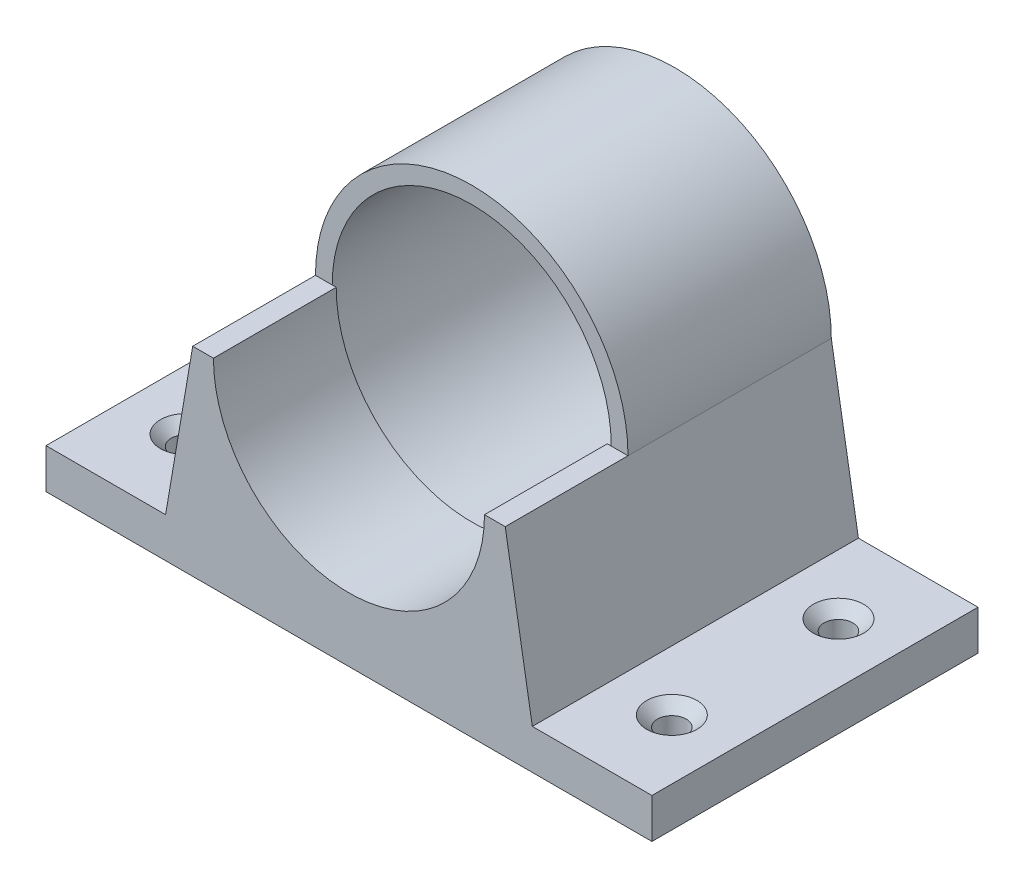
ISO-10303-21;
HEADER;
FILE_DESCRIPTION(('STEP AP214'),'2;1');
FILE_NAME('part.step','',(''),(''),'','','');
FILE_SCHEMA(('AUTOMOTIVE_DESIGN { 1 0 10303 214 1 1 1 1 }'));
ENDSEC;
DATA;
#1=APPLICATION_CONTEXT('core data for automotive mechanical design processes');
#2=APPLICATION_PROTOCOL_DEFINITION('international standard','automotive_design',2000,#1);
#3=PRODUCT_CONTEXT('',#1,'mechanical');
#4=PRODUCT('Part','Part','',(#3));
#5=PRODUCT_RELATED_PRODUCT_CATEGORY('part','',(#4));
#6=PRODUCT_DEFINITION_FORMATION('','',#4);
#7=PRODUCT_DEFINITION_CONTEXT('part definition',#1,'design');
#8=PRODUCT_DEFINITION('design','',#6,#7);
#9=PRODUCT_DEFINITION_SHAPE('','',#8);
#10=(LENGTH_UNIT() NAMED_UNIT(*) SI_UNIT(.MILLI.,.METRE.));
#11=(NAMED_UNIT(*) PLANE_ANGLE_UNIT() SI_UNIT($,.RADIAN.));
#12=(NAMED_UNIT(*) SI_UNIT($,.STERADIAN.) SOLID_ANGLE_UNIT());
#13=UNCERTAINTY_MEASURE_WITH_UNIT(LENGTH_MEASURE(1.E-05),#10,'distance_accuracy_value','');
#14=(GEOMETRIC_REPRESENTATION_CONTEXT(3) GLOBAL_UNCERTAINTY_ASSIGNED_CONTEXT((#13)) GLOBAL_UNIT_ASSIGNED_CONTEXT((#10,
#11,#12)) REPRESENTATION_CONTEXT('',''));
#15=CARTESIAN_POINT('',(0.,0.,0.));
#16=DIRECTION('',(0.,0.,1.));
#17=DIRECTION('',(1.,0.,0.));
#18=AXIS2_PLACEMENT_3D('',#15,#16,#17);
#19=CARTESIAN_POINT('',(0.,18.1533956791324,0.));
#20=DIRECTION('',(0.,0.,-1.));
#21=DIRECTION('',(-1.,0.,0.));
#22=AXIS2_PLACEMENT_3D('',#19,#20,#21);
#23=PLANE('',#22);
#24=CARTESIAN_POINT('',(0.,18.1533956791324,0.));
#25=DIRECTION('',(0.,0.,1.));
#26=DIRECTION('',(1.,0.,0.));
#27=AXIS2_PLACEMENT_3D('',#24,#25,#26);
#28=CIRCLE('',#27,17.5);
#29=CARTESIAN_POINT('',(17.5,18.1533956791324,0.));
#30=VERTEX_POINT('',#29);
#31=CARTESIAN_POINT('',(-17.5,18.1533956791324,0.));
#32=VERTEX_POINT('',#31);
#33=EDGE_CURVE('E226',#30,#32,#28,.T.);
#34=ORIENTED_EDGE('',*,*,#33,.F.);
#35=DIRECTION('',(1.,0.,0.));
#36=VECTOR('',#35,1.);
#37=CARTESIAN_POINT('',(0.,18.1533956791324,0.));
#38=LINE('',#37,#36);
#39=CARTESIAN_POINT('',(19.6,18.1533956791324,0.));
#40=VERTEX_POINT('',#39);
#41=EDGE_CURVE('E258',#30,#40,#38,.T.);
#42=ORIENTED_EDGE('',*,*,#41,.T.);
#43=CARTESIAN_POINT('',(0.,18.1533956791324,0.));
#44=DIRECTION('',(0.,0.,1.));
#45=DIRECTION('',(1.,0.,0.));
#46=AXIS2_PLACEMENT_3D('',#43,#44,#45);
#47=CIRCLE('',#46,19.6);
#48=CARTESIAN_POINT('',(-19.6,18.1533956791324,0.));
#49=VERTEX_POINT('',#48);
#50=EDGE_CURVE('E246',#40,#49,#47,.T.);
#51=ORIENTED_EDGE('',*,*,#50,.T.);
#52=DIRECTION('',(1.,0.,0.));
#53=VECTOR('',#52,1.);
#54=CARTESIAN_POINT('',(0.,18.1533956791324,0.));
#55=LINE('',#54,#53);
#56=EDGE_CURVE('E256',#49,#32,#55,.T.);
#57=ORIENTED_EDGE('',*,*,#56,.T.);
#58=EDGE_LOOP('',(#34,#42,#51,#57));
#59=FACE_BOUND('',#58,.T.);
#60=ADVANCED_FACE('F52',(#59),#23,.F.);
#61=CARTESIAN_POINT('',(0.,18.1533956791324,-25.5));
#62=DIRECTION('',(0.,0.,1.));
#63=DIRECTION('',(1.,0.,0.));
#64=AXIS2_PLACEMENT_3D('',#61,#62,#63);
#65=CYLINDRICAL_SURFACE('',#64,19.6);
#66=DIRECTION('',(0.,0.,-1.));
#67=VECTOR('',#66,1.);
#68=CARTESIAN_POINT('',(-19.6,18.1533956791324,15.4));
#69=LINE('',#68,#67);
#70=CARTESIAN_POINT('',(-19.6,18.1533956791324,-25.5));
#71=VERTEX_POINT('',#70);
#72=EDGE_CURVE('E227',#49,#71,#69,.T.);
#73=ORIENTED_EDGE('',*,*,#72,.F.);
#74=ORIENTED_EDGE('',*,*,#50,.F.);
#75=DIRECTION('',(0.,0.,-1.));
#76=VECTOR('',#75,1.);
#77=CARTESIAN_POINT('',(19.6,18.1533956791324,15.4));
#78=LINE('',#77,#76);
#79=CARTESIAN_POINT('',(19.6,18.1533956791324,-25.5));
#80=VERTEX_POINT('',#79);
#81=EDGE_CURVE('E223',#40,#80,#78,.T.);
#82=ORIENTED_EDGE('',*,*,#81,.T.);
#83=CARTESIAN_POINT('',(0.,18.1533956791324,-25.5));
#84=DIRECTION('',(0.,0.,-1.));
#85=DIRECTION('',(-1.,0.,0.));
#86=AXIS2_PLACEMENT_3D('',#83,#84,#85);
#87=CIRCLE('',#86,19.6);
#88=EDGE_CURVE('E155',#71,#80,#87,.T.);
#89=ORIENTED_EDGE('',*,*,#88,.F.);
#90=EDGE_LOOP('',(#73,#74,#82,#89));
#91=FACE_BOUND('',#90,.T.);
#92=ADVANCED_FACE('F54',(#91),#65,.T.);
#93=CARTESIAN_POINT('',(0.,18.1533956791324,-25.5));
#94=DIRECTION('',(0.,0.,-1.));
#95=DIRECTION('',(-1.,0.,0.));
#96=AXIS2_PLACEMENT_3D('',#93,#94,#95);
#97=PLANE('',#96);
#98=CARTESIAN_POINT('',(0.,18.1533956791324,-25.5));
#99=DIRECTION('',(0.,0.,1.));
#100=DIRECTION('',(1.,0.,0.));
#101=AXIS2_PLACEMENT_3D('',#98,#99,#100);
#102=CIRCLE('',#101,17.5);
#103=CARTESIAN_POINT('',(17.5,18.1533956791324,-25.5));
#104=VERTEX_POINT('',#103);
#105=EDGE_CURVE('E243',#104,#104,#102,.T.);
#106=ORIENTED_EDGE('',*,*,#105,.T.);
#107=EDGE_LOOP('',(#106));
#108=FACE_BOUND('',#107,.T.);
#109=ORIENTED_EDGE('',*,*,#88,.T.);
#110=DIRECTION('',(0.167595493933869,-0.985855846669817,0.));
#111=VECTOR('',#110,1.);
#112=CARTESIAN_POINT('',(19.6,18.1533956791324,-25.5));
#113=LINE('',#112,#111);
#114=CARTESIAN_POINT('',(23.,-1.84660432086758,-25.5));
#115=VERTEX_POINT('',#114);
#116=EDGE_CURVE('E185',#80,#115,#113,.T.);
#117=ORIENTED_EDGE('',*,*,#116,.T.);
#118=DIRECTION('',(1.,0.,0.));
#119=VECTOR('',#118,1.);
#120=CARTESIAN_POINT('',(23.,-1.84660432086758,-25.5));
#121=LINE('',#120,#119);
#122=CARTESIAN_POINT('',(38.,-1.84660432086758,-25.5));
#123=VERTEX_POINT('',#122);
#124=EDGE_CURVE('E188',#115,#123,#121,.T.);
#125=ORIENTED_EDGE('',*,*,#124,.T.);
#126=DIRECTION('',(0.,-1.,0.));
#127=VECTOR('',#126,1.);
#128=CARTESIAN_POINT('',(38.,-1.84660432086758,-25.5));
#129=LINE('',#128,#127);
#130=CARTESIAN_POINT('',(38.,-6.84660432086758,-25.5));
#131=VERTEX_POINT('',#130);
#132=EDGE_CURVE('E191',#123,#131,#129,.T.);
#133=ORIENTED_EDGE('',*,*,#132,.T.);
#134=DIRECTION('',(1.,0.,0.));
#135=VECTOR('',#134,1.);
#136=CARTESIAN_POINT('',(-38.,-6.84660432086758,-25.5));
#137=LINE('',#136,#135);
#138=CARTESIAN_POINT('',(-38.,-6.84660432086758,-25.5));
#139=VERTEX_POINT('',#138);
#140=EDGE_CURVE('E194',#139,#131,#137,.T.);
#141=ORIENTED_EDGE('',*,*,#140,.F.);
#142=DIRECTION('',(0.,-1.,0.));
#143=VECTOR('',#142,1.);
#144=CARTESIAN_POINT('',(-38.,-1.84660432086758,-25.5));
#145=LINE('',#144,#143);
#146=CARTESIAN_POINT('',(-38.,-1.84660432086758,-25.5));
#147=VERTEX_POINT('',#146);
#148=EDGE_CURVE('E197',#147,#139,#145,.T.);
#149=ORIENTED_EDGE('',*,*,#148,.F.);
#150=DIRECTION('',(-1.,0.,0.));
#151=VECTOR('',#150,1.);
#152=CARTESIAN_POINT('',(-23.,-1.84660432086758,-25.5));
#153=LINE('',#152,#151);
#154=CARTESIAN_POINT('',(-23.,-1.84660432086758,-25.5));
#155=VERTEX_POINT('',#154);
#156=EDGE_CURVE('E200',#155,#147,#153,.T.);
#157=ORIENTED_EDGE('',*,*,#156,.F.);
#158=DIRECTION('',(0.167595493933869,0.985855846669817,0.));
#159=VECTOR('',#158,1.);
#160=CARTESIAN_POINT('',(-23.,-1.84660432086758,-25.5));
#161=LINE('',#160,#159);
#162=EDGE_CURVE('E203',#155,#71,#161,.T.);
#163=ORIENTED_EDGE('',*,*,#162,.T.);
#164=EDGE_LOOP('',(#109,#117,#125,#133,#141,#149,#157,#163));
#165=FACE_BOUND('',#164,.T.);
#166=ADVANCED_FACE('F327',(#108,#165),#97,.T.);
#167=CARTESIAN_POINT('',(0.,18.1533956791324,-25.5));
#168=DIRECTION('',(0.,0.,1.));
#169=DIRECTION('',(1.,0.,0.));
#170=AXIS2_PLACEMENT_3D('',#167,#168,#169);
#171=CYLINDRICAL_SURFACE('',#170,17.5);
#172=ORIENTED_EDGE('',*,*,#105,.F.);
#173=EDGE_LOOP('',(#172));
#174=FACE_BOUND('',#173,.T.);
#175=ORIENTED_EDGE('',*,*,#33,.T.);
#176=CARTESIAN_POINT('',(0.,18.1533956791324,0.));
#177=DIRECTION('',(0.,0.,1.));
#178=DIRECTION('',(1.,0.,0.));
#179=AXIS2_PLACEMENT_3D('',#176,#177,#178);
#180=CIRCLE('',#179,17.5);
#181=EDGE_CURVE('E285',#30,#32,#180,.F.);
#182=ORIENTED_EDGE('',*,*,#181,.F.);
#183=EDGE_LOOP('',(#175,#182));
#184=FACE_BOUND('',#183,.T.);
#185=ADVANCED_FACE('F391',(#174,#184),#171,.F.);
#186=CARTESIAN_POINT('',(-23.,-1.84660432086758,15.4));
#187=DIRECTION('',(-0.985855846669818,0.167595493933869,0.));
#188=DIRECTION('',(-0.167595493933869,-0.985855846669818,0.));
#189=AXIS2_PLACEMENT_3D('',#186,#187,#188);
#190=PLANE('',#189);
#191=CARTESIAN_POINT('',(-19.6,18.1533956791324,15.4));
#192=VERTEX_POINT('',#191);
#193=EDGE_CURVE('E224',#192,#49,#69,.T.);
#194=ORIENTED_EDGE('',*,*,#193,.T.);
#195=ORIENTED_EDGE('',*,*,#72,.T.);
#196=ORIENTED_EDGE('',*,*,#162,.F.);
#197=DIRECTION('',(0.,0.,-1.));
#198=VECTOR('',#197,1.);
#199=CARTESIAN_POINT('',(-23.,-1.84660432086758,15.4));
#200=LINE('',#199,#198);
#201=CARTESIAN_POINT('',(-23.,-1.84660432086758,15.4));
#202=VERTEX_POINT('',#201);
#203=EDGE_CURVE('E228',#202,#155,#200,.T.);
#204=ORIENTED_EDGE('',*,*,#203,.F.);
#205=DIRECTION('',(0.167595493933869,0.985855846669817,0.));
#206=VECTOR('',#205,1.);
#207=CARTESIAN_POINT('',(-23.,-1.84660432086758,15.4));
#208=LINE('',#207,#206);
#209=EDGE_CURVE('E221',#202,#192,#208,.T.);
#210=ORIENTED_EDGE('',*,*,#209,.T.);
#211=EDGE_LOOP('',(#194,#195,#196,#204,#210));
#212=FACE_BOUND('',#211,.T.);
#213=ADVANCED_FACE('F314',(#212),#190,.T.);
#214=CARTESIAN_POINT('',(-23.,-1.84660432086758,15.4));
#215=DIRECTION('',(0.,-1.,0.));
#216=DIRECTION('',(1.,0.,0.));
#217=AXIS2_PLACEMENT_3D('',#214,#215,#216);
#218=PLANE('',#217);
#219=CARTESIAN_POINT('',(-30.5,-1.84660432086758,-15.5));
#220=DIRECTION('',(0.,1.,0.));
#221=DIRECTION('',(0.,0.,1.));
#222=AXIS2_PLACEMENT_3D('',#219,#220,#221);
#223=CIRCLE('',#222,3.15);
#224=CARTESIAN_POINT('',(-30.5,-1.84660432086758,-12.35));
#225=VERTEX_POINT('',#224);
#226=EDGE_CURVE('E176',#225,#225,#223,.T.);
#227=ORIENTED_EDGE('',*,*,#226,.F.);
#228=EDGE_LOOP('',(#227));
#229=FACE_BOUND('',#228,.T.);
#230=CARTESIAN_POINT('',(-30.5,-1.84660432086758,5.4));
#231=DIRECTION('',(0.,1.,0.));
#232=DIRECTION('',(0.,0.,1.));
#233=AXIS2_PLACEMENT_3D('',#230,#231,#232);
#234=CIRCLE('',#233,3.15);
#235=CARTESIAN_POINT('',(-30.5,-1.84660432086758,8.55));
#236=VERTEX_POINT('',#235);
#237=EDGE_CURVE('E169',#236,#236,#234,.T.);
#238=ORIENTED_EDGE('',*,*,#237,.F.);
#239=EDGE_LOOP('',(#238));
#240=FACE_BOUND('',#239,.T.);
#241=ORIENTED_EDGE('',*,*,#203,.T.);
#242=ORIENTED_EDGE('',*,*,#156,.T.);
#243=DIRECTION('',(0.,0.,-1.));
#244=VECTOR('',#243,1.);
#245=CARTESIAN_POINT('',(-38.,-1.84660432086758,15.4));
#246=LINE('',#245,#244);
#247=CARTESIAN_POINT('',(-38.,-1.84660432086758,15.4));
#248=VERTEX_POINT('',#247);
#249=EDGE_CURVE('E230',#248,#147,#246,.T.);
#250=ORIENTED_EDGE('',*,*,#249,.F.);
#251=DIRECTION('',(-1.,0.,0.));
#252=VECTOR('',#251,1.);
#253=CARTESIAN_POINT('',(-23.,-1.84660432086758,15.4));
#254=LINE('',#253,#252);
#255=EDGE_CURVE('E219',#202,#248,#254,.T.);
#256=ORIENTED_EDGE('',*,*,#255,.F.);
#257=EDGE_LOOP('',(#241,#242,#250,#256));
#258=FACE_BOUND('',#257,.T.);
#259=ADVANCED_FACE('F310',(#229,#240,#258),#218,.F.);
#260=CARTESIAN_POINT('',(-38.,-1.84660432086758,15.4));
#261=DIRECTION('',(1.,0.,0.));
#262=DIRECTION('',(0.,0.,-1.));
#263=AXIS2_PLACEMENT_3D('',#260,#261,#262);
#264=PLANE('',#263);
#265=ORIENTED_EDGE('',*,*,#249,.T.);
#266=ORIENTED_EDGE('',*,*,#148,.T.);
#267=DIRECTION('',(0.,0.,-1.));
#268=VECTOR('',#267,1.);
#269=CARTESIAN_POINT('',(-38.,-6.84660432086758,15.4));
#270=LINE('',#269,#268);
#271=CARTESIAN_POINT('',(-38.,-6.84660432086758,15.4));
#272=VERTEX_POINT('',#271);
#273=EDGE_CURVE('E232',#272,#139,#270,.T.);
#274=ORIENTED_EDGE('',*,*,#273,.F.);
#275=DIRECTION('',(0.,-1.,0.));
#276=VECTOR('',#275,1.);
#277=CARTESIAN_POINT('',(-38.,-1.84660432086758,15.4));
#278=LINE('',#277,#276);
#279=EDGE_CURVE('E217',#248,#272,#278,.T.);
#280=ORIENTED_EDGE('',*,*,#279,.F.);
#281=EDGE_LOOP('',(#265,#266,#274,#280));
#282=FACE_BOUND('',#281,.T.);
#283=ADVANCED_FACE('F313',(#282),#264,.F.);
#284=CARTESIAN_POINT('',(-38.,-6.84660432086758,15.4));
#285=DIRECTION('',(0.,1.,0.));
#286=DIRECTION('',(0.,0.,1.));
#287=AXIS2_PLACEMENT_3D('',#284,#285,#286);
#288=PLANE('',#287);
#289=CARTESIAN_POINT('',(30.5,-6.84660432086761,5.4));
#290=DIRECTION('',(0.,1.,0.));
#291=DIRECTION('',(0.,0.,1.));
#292=AXIS2_PLACEMENT_3D('',#289,#290,#291);
#293=CIRCLE('',#292,1.8);
#294=CARTESIAN_POINT('',(30.5,-6.84660432086761,7.2));
#295=VERTEX_POINT('',#294);
#296=EDGE_CURVE('E294',#295,#295,#293,.T.);
#297=ORIENTED_EDGE('',*,*,#296,.T.);
#298=EDGE_LOOP('',(#297));
#299=FACE_BOUND('',#298,.T.);
#300=CARTESIAN_POINT('',(30.5,-6.84660432086761,-15.5));
#301=DIRECTION('',(0.,1.,0.));
#302=DIRECTION('',(0.,0.,1.));
#303=AXIS2_PLACEMENT_3D('',#300,#301,#302);
#304=CIRCLE('',#303,1.8);
#305=CARTESIAN_POINT('',(30.5,-6.84660432086761,-13.7));
#306=VERTEX_POINT('',#305);
#307=EDGE_CURVE('E303',#306,#306,#304,.T.);
#308=ORIENTED_EDGE('',*,*,#307,.T.);
#309=EDGE_LOOP('',(#308));
#310=FACE_BOUND('',#309,.T.);
#311=CARTESIAN_POINT('',(-30.5,-6.8466043208676,-15.5));
#312=DIRECTION('',(0.,1.,0.));
#313=DIRECTION('',(0.,0.,1.));
#314=AXIS2_PLACEMENT_3D('',#311,#312,#313);
#315=CIRCLE('',#314,1.8);
#316=CARTESIAN_POINT('',(-31.6901796266715,-6.84660432166725,-14.1496398790485));
#317=VERTEX_POINT('',#316);
#318=CARTESIAN_POINT('',(-31.7573024059841,-6.8466043208676,-16.7880957495103));
#319=VERTEX_POINT('',#318);
#320=EDGE_CURVE('E164',#317,#319,#315,.T.);
#321=ORIENTED_EDGE('',*,*,#320,.T.);
#322=CARTESIAN_POINT('',(-32.9482803004892,-6.84660432086758,-15.4377153410314));
#323=DIRECTION('',(0.,1.,0.));
#324=DIRECTION('',(0.999676555950965,0.,-0.0254319382276887));
#325=AXIS2_PLACEMENT_3D('',#322,#323,#324);
#326=ELLIPSE('',#325,1.80117420355769,1.79999999999999);
#327=EDGE_CURVE('E159',#319,#317,#326,.T.);
#328=ORIENTED_EDGE('',*,*,#327,.T.);
#329=EDGE_LOOP('',(#321,#328));
#330=FACE_BOUND('',#329,.T.);
#331=CARTESIAN_POINT('',(-30.5,-6.8466043208676,5.4));
#332=DIRECTION('',(0.,1.,0.));
#333=DIRECTION('',(0.,0.,1.));
#334=AXIS2_PLACEMENT_3D('',#331,#332,#333);
#335=CIRCLE('',#334,1.8);
#336=CARTESIAN_POINT('',(-31.1501324707505,-6.84660432166725,7.07848972903497));
#337=VERTEX_POINT('',#336);
#338=CARTESIAN_POINT('',(-31.2346383830945,-6.8466043208676,3.75673908155633));
#339=VERTEX_POINT('',#338);
#340=EDGE_CURVE('E182',#337,#339,#335,.T.);
#341=ORIENTED_EDGE('',*,*,#340,.T.);
#342=CARTESIAN_POINT('',(-31.885222499378,-6.84660432086758,5.43524029129845));
#343=DIRECTION('',(0.,1.,0.));
#344=DIRECTION('',(0.999676555950965,0.,-0.0254319382276887));
#345=AXIS2_PLACEMENT_3D('',#342,#343,#344);
#346=ELLIPSE('',#345,1.80117420355771,1.8);
#347=EDGE_CURVE('E165',#339,#337,#346,.T.);
#348=ORIENTED_EDGE('',*,*,#347,.T.);
#349=EDGE_LOOP('',(#341,#348));
#350=FACE_BOUND('',#349,.T.);
#351=ORIENTED_EDGE('',*,*,#273,.T.);
#352=ORIENTED_EDGE('',*,*,#140,.T.);
#353=DIRECTION('',(0.,0.,-1.));
#354=VECTOR('',#353,1.);
#355=CARTESIAN_POINT('',(38.,-6.84660432086758,15.4));
#356=LINE('',#355,#354);
#357=CARTESIAN_POINT('',(38.,-6.84660432086758,15.4));
#358=VERTEX_POINT('',#357);
#359=EDGE_CURVE('E234',#358,#131,#356,.T.);
#360=ORIENTED_EDGE('',*,*,#359,.F.);
#361=DIRECTION('',(1.,0.,0.));
#362=VECTOR('',#361,1.);
#363=CARTESIAN_POINT('',(-38.,-6.84660432086758,15.4));
#364=LINE('',#363,#362);
#365=EDGE_CURVE('E215',#272,#358,#364,.T.);
#366=ORIENTED_EDGE('',*,*,#365,.F.);
#367=EDGE_LOOP('',(#351,#352,#360,#366));
#368=FACE_BOUND('',#367,.T.);
#369=ADVANCED_FACE('F162',(#299,#310,#330,#350,#368),#288,.F.);
#370=CARTESIAN_POINT('',(38.,-1.84660432086758,15.4));
#371=DIRECTION('',(1.,0.,0.));
#372=DIRECTION('',(0.,0.,-1.));
#373=AXIS2_PLACEMENT_3D('',#370,#371,#372);
#374=PLANE('',#373);
#375=ORIENTED_EDGE('',*,*,#359,.T.);
#376=ORIENTED_EDGE('',*,*,#132,.F.);
#377=DIRECTION('',(0.,0.,-1.));
#378=VECTOR('',#377,1.);
#379=CARTESIAN_POINT('',(38.,-1.84660432086758,15.4));
#380=LINE('',#379,#378);
#381=CARTESIAN_POINT('',(38.,-1.84660432086758,15.4));
#382=VERTEX_POINT('',#381);
#383=EDGE_CURVE('E236',#382,#123,#380,.T.);
#384=ORIENTED_EDGE('',*,*,#383,.F.);
#385=DIRECTION('',(0.,-1.,0.));
#386=VECTOR('',#385,1.);
#387=CARTESIAN_POINT('',(38.,-1.84660432086758,15.4));
#388=LINE('',#387,#386);
#389=EDGE_CURVE('E212',#382,#358,#388,.T.);
#390=ORIENTED_EDGE('',*,*,#389,.T.);
#391=EDGE_LOOP('',(#375,#376,#384,#390));
#392=FACE_BOUND('',#391,.T.);
#393=ADVANCED_FACE('F344',(#392),#374,.T.);
#394=CARTESIAN_POINT('',(23.,-1.84660432086758,15.4));
#395=DIRECTION('',(0.,1.,0.));
#396=DIRECTION('',(-1.,0.,0.));
#397=AXIS2_PLACEMENT_3D('',#394,#395,#396);
#398=PLANE('',#397);
#399=CARTESIAN_POINT('',(30.5,-1.84660432086758,5.4));
#400=DIRECTION('',(0.,1.,0.));
#401=DIRECTION('',(0.,0.,1.));
#402=AXIS2_PLACEMENT_3D('',#399,#400,#401);
#403=CIRCLE('',#402,3.15);
#404=CARTESIAN_POINT('',(30.5,-1.84660432086758,8.55));
#405=VERTEX_POINT('',#404);
#406=EDGE_CURVE('E288',#405,#405,#403,.T.);
#407=ORIENTED_EDGE('',*,*,#406,.F.);
#408=EDGE_LOOP('',(#407));
#409=FACE_BOUND('',#408,.T.);
#410=CARTESIAN_POINT('',(30.5,-1.84660432086758,-15.5));
#411=DIRECTION('',(0.,1.,0.));
#412=DIRECTION('',(0.,0.,1.));
#413=AXIS2_PLACEMENT_3D('',#410,#411,#412);
#414=CIRCLE('',#413,3.15);
#415=CARTESIAN_POINT('',(30.5,-1.84660432086758,-12.35));
#416=VERTEX_POINT('',#415);
#417=EDGE_CURVE('E297',#416,#416,#414,.T.);
#418=ORIENTED_EDGE('',*,*,#417,.F.);
#419=EDGE_LOOP('',(#418));
#420=FACE_BOUND('',#419,.T.);
#421=ORIENTED_EDGE('',*,*,#383,.T.);
#422=ORIENTED_EDGE('',*,*,#124,.F.);
#423=DIRECTION('',(0.,0.,-1.));
#424=VECTOR('',#423,1.);
#425=CARTESIAN_POINT('',(23.,-1.84660432086758,15.4));
#426=LINE('',#425,#424);
#427=CARTESIAN_POINT('',(23.,-1.84660432086758,15.4));
#428=VERTEX_POINT('',#427);
#429=EDGE_CURVE('E238',#428,#115,#426,.T.);
#430=ORIENTED_EDGE('',*,*,#429,.F.);
#431=DIRECTION('',(1.,0.,0.));
#432=VECTOR('',#431,1.);
#433=CARTESIAN_POINT('',(23.,-1.84660432086758,15.4));
#434=LINE('',#433,#432);
#435=EDGE_CURVE('E209',#428,#382,#434,.T.);
#436=ORIENTED_EDGE('',*,*,#435,.T.);
#437=EDGE_LOOP('',(#421,#422,#430,#436));
#438=FACE_BOUND('',#437,.T.);
#439=ADVANCED_FACE('F341',(#409,#420,#438),#398,.T.);
#440=CARTESIAN_POINT('',(19.6,18.1533956791324,15.4));
#441=DIRECTION('',(0.985855846669818,0.167595493933869,0.));
#442=DIRECTION('',(-0.167595493933869,0.985855846669818,0.));
#443=AXIS2_PLACEMENT_3D('',#440,#441,#442);
#444=PLANE('',#443);
#445=ORIENTED_EDGE('',*,*,#429,.T.);
#446=ORIENTED_EDGE('',*,*,#116,.F.);
#447=ORIENTED_EDGE('',*,*,#81,.F.);
#448=CARTESIAN_POINT('',(19.6,18.1533956791324,15.4));
#449=VERTEX_POINT('',#448);
#450=EDGE_CURVE('E240',#449,#40,#78,.T.);
#451=ORIENTED_EDGE('',*,*,#450,.F.);
#452=DIRECTION('',(0.167595493933869,-0.985855846669817,0.));
#453=VECTOR('',#452,1.);
#454=CARTESIAN_POINT('',(19.6,18.1533956791324,15.4));
#455=LINE('',#454,#453);
#456=EDGE_CURVE('E206',#449,#428,#455,.T.);
#457=ORIENTED_EDGE('',*,*,#456,.T.);
#458=EDGE_LOOP('',(#445,#446,#447,#451,#457));
#459=FACE_BOUND('',#458,.T.);
#460=ADVANCED_FACE('F347',(#459),#444,.T.);
#461=CARTESIAN_POINT('',(0.,18.1533956791324,15.4));
#462=DIRECTION('',(0.,0.,1.));
#463=DIRECTION('',(1.,0.,0.));
#464=AXIS2_PLACEMENT_3D('',#461,#462,#463);
#465=PLANE('',#464);
#466=ORIENTED_EDGE('',*,*,#456,.F.);
#467=DIRECTION('',(1.,0.,0.));
#468=VECTOR('',#467,1.);
#469=CARTESIAN_POINT('',(0.,18.1533956791324,15.4));
#470=LINE('',#469,#468);
#471=CARTESIAN_POINT('',(17.,18.1533956791324,15.4));
#472=VERTEX_POINT('',#471);
#473=EDGE_CURVE('E271',#472,#449,#470,.T.);
#474=ORIENTED_EDGE('',*,*,#473,.F.);
#475=CARTESIAN_POINT('',(0.,18.1533956791324,15.4));
#476=DIRECTION('',(0.,0.,1.));
#477=DIRECTION('',(1.,0.,0.));
#478=AXIS2_PLACEMENT_3D('',#475,#476,#477);
#479=CIRCLE('',#478,17.);
#480=CARTESIAN_POINT('',(-17.,18.1533956791324,15.4));
#481=VERTEX_POINT('',#480);
#482=EDGE_CURVE('E274',#472,#481,#479,.F.);
#483=ORIENTED_EDGE('',*,*,#482,.T.);
#484=DIRECTION('',(1.,0.,0.));
#485=VECTOR('',#484,1.);
#486=CARTESIAN_POINT('',(0.,18.1533956791324,15.4));
#487=LINE('',#486,#485);
#488=EDGE_CURVE('E283',#192,#481,#487,.T.);
#489=ORIENTED_EDGE('',*,*,#488,.F.);
#490=ORIENTED_EDGE('',*,*,#209,.F.);
#491=ORIENTED_EDGE('',*,*,#255,.T.);
#492=ORIENTED_EDGE('',*,*,#279,.T.);
#493=ORIENTED_EDGE('',*,*,#365,.T.);
#494=ORIENTED_EDGE('',*,*,#389,.F.);
#495=ORIENTED_EDGE('',*,*,#435,.F.);
#496=EDGE_LOOP('',(#466,#474,#483,#489,#490,#491,#492,#493,#494,#495));
#497=FACE_BOUND('',#496,.T.);
#498=ADVANCED_FACE('F334',(#497),#465,.T.);
#499=CARTESIAN_POINT('',(-30.5,-1.84660432086758,5.4));
#500=DIRECTION('',(0.,1.,0.));
#501=DIRECTION('',(0.,0.,1.));
#502=AXIS2_PLACEMENT_3D('',#499,#500,#501);
#503=CYLINDRICAL_SURFACE('',#502,1.8);
#504=ORIENTED_EDGE('',*,*,#340,.F.);
#505=CARTESIAN_POINT('',(-30.5,-6.87162560958618,5.4));
#506=DIRECTION('',(0.0360908865319125,0.999348089954104,-0.000918158169658168));
#507=DIRECTION('',(-0.999024856761494,0.0361025636912934,0.0254153588916714));
#508=AXIS2_PLACEMENT_3D('',#505,#506,#507);
#509=ELLIPSE('',#508,1.80117420355771,1.8);
#510=EDGE_CURVE('E12',#337,#339,#509,.F.);
#511=ORIENTED_EDGE('',*,*,#510,.T.);
#512=EDGE_LOOP('',(#504,#511));
#513=FACE_BOUND('',#512,.T.);
#514=CARTESIAN_POINT('',(-30.5,-3.19660432086758,5.4));
#515=DIRECTION('',(0.,1.,0.));
#516=DIRECTION('',(0.,0.,1.));
#517=AXIS2_PLACEMENT_3D('',#514,#515,#516);
#518=CIRCLE('',#517,1.8);
#519=CARTESIAN_POINT('',(-30.5,-3.19660432086758,7.2));
#520=VERTEX_POINT('',#519);
#521=EDGE_CURVE('E173',#520,#520,#518,.T.);
#522=ORIENTED_EDGE('',*,*,#521,.T.);
#523=EDGE_LOOP('',(#522));
#524=FACE_BOUND('',#523,.T.);
#525=ADVANCED_FACE('F369',(#513,#524),#503,.F.);
#526=CARTESIAN_POINT('',(-30.5,-1.84660432086758,5.4));
#527=DIRECTION('',(0.,1.,0.));
#528=DIRECTION('',(0.,0.,1.));
#529=AXIS2_PLACEMENT_3D('',#526,#527,#528);
#530=CONICAL_SURFACE('',#529,3.15,0.785398163397448);
#531=ORIENTED_EDGE('',*,*,#521,.F.);
#532=EDGE_LOOP('',(#531));
#533=FACE_BOUND('',#532,.T.);
#534=ORIENTED_EDGE('',*,*,#237,.T.);
#535=EDGE_LOOP('',(#534));
#536=FACE_BOUND('',#535,.T.);
#537=ADVANCED_FACE('F429',(#533,#536),#530,.F.);
#538=CARTESIAN_POINT('',(-30.5,-1.84660432086758,-15.5));
#539=DIRECTION('',(0.,1.,0.));
#540=DIRECTION('',(0.,0.,1.));
#541=AXIS2_PLACEMENT_3D('',#538,#539,#540);
#542=CYLINDRICAL_SURFACE('',#541,1.8);
#543=ORIENTED_EDGE('',*,*,#320,.F.);
#544=CARTESIAN_POINT('',(-30.5,-6.89082763332421,-15.5));
#545=DIRECTION('',(0.0360908865319125,0.999348089954104,-0.000918158169658168));
#546=DIRECTION('',(-0.999024856761494,0.0361025636912934,0.0254153588916714));
#547=AXIS2_PLACEMENT_3D('',#544,#545,#546);
#548=ELLIPSE('',#547,1.80117420355771,1.8);
#549=EDGE_CURVE('E60',#317,#319,#548,.F.);
#550=ORIENTED_EDGE('',*,*,#549,.T.);
#551=EDGE_LOOP('',(#543,#550));
#552=FACE_BOUND('',#551,.T.);
#553=CARTESIAN_POINT('',(-30.5,-3.19660432086758,-15.5));
#554=DIRECTION('',(0.,1.,0.));
#555=DIRECTION('',(0.,0.,1.));
#556=AXIS2_PLACEMENT_3D('',#553,#554,#555);
#557=CIRCLE('',#556,1.8);
#558=CARTESIAN_POINT('',(-30.5,-3.19660432086758,-13.7));
#559=VERTEX_POINT('',#558);
#560=EDGE_CURVE('E170',#559,#559,#557,.T.);
#561=ORIENTED_EDGE('',*,*,#560,.T.);
#562=EDGE_LOOP('',(#561));
#563=FACE_BOUND('',#562,.T.);
#564=ADVANCED_FACE('F167',(#552,#563),#542,.F.);
#565=CARTESIAN_POINT('',(-30.5,-1.84660432086758,-15.5));
#566=DIRECTION('',(0.,1.,0.));
#567=DIRECTION('',(0.,0.,1.));
#568=AXIS2_PLACEMENT_3D('',#565,#566,#567);
#569=CONICAL_SURFACE('',#568,3.15,0.785398163397448);
#570=ORIENTED_EDGE('',*,*,#560,.F.);
#571=EDGE_LOOP('',(#570));
#572=FACE_BOUND('',#571,.T.);
#573=ORIENTED_EDGE('',*,*,#226,.T.);
#574=EDGE_LOOP('',(#573));
#575=FACE_BOUND('',#574,.T.);
#576=ADVANCED_FACE('F308',(#572,#575),#569,.F.);
#577=CARTESIAN_POINT('',(30.5,-1.84660432086758,-15.5));
#578=DIRECTION('',(0.,1.,0.));
#579=DIRECTION('',(0.,0.,1.));
#580=AXIS2_PLACEMENT_3D('',#577,#578,#579);
#581=CYLINDRICAL_SURFACE('',#580,1.79999999999999);
#582=ORIENTED_EDGE('',*,*,#307,.F.);
#583=EDGE_LOOP('',(#582));
#584=FACE_BOUND('',#583,.T.);
#585=CARTESIAN_POINT('',(30.5,-3.19660432086759,-15.5));
#586=DIRECTION('',(0.,1.,0.));
#587=DIRECTION('',(0.,0.,1.));
#588=AXIS2_PLACEMENT_3D('',#585,#586,#587);
#589=CIRCLE('',#588,1.79999999999999);
#590=CARTESIAN_POINT('',(30.5,-3.19660432086759,-13.7));
#591=VERTEX_POINT('',#590);
#592=EDGE_CURVE('E300',#591,#591,#589,.T.);
#593=ORIENTED_EDGE('',*,*,#592,.T.);
#594=EDGE_LOOP('',(#593));
#595=FACE_BOUND('',#594,.T.);
#596=ADVANCED_FACE('F409',(#584,#595),#581,.F.);
#597=CARTESIAN_POINT('',(30.5,-1.84660432086758,-15.5));
#598=DIRECTION('',(0.,1.,0.));
#599=DIRECTION('',(0.,0.,1.));
#600=AXIS2_PLACEMENT_3D('',#597,#598,#599);
#601=CONICAL_SURFACE('',#600,3.15,0.78539816339745);
#602=ORIENTED_EDGE('',*,*,#592,.F.);
#603=EDGE_LOOP('',(#602));
#604=FACE_BOUND('',#603,.T.);
#605=ORIENTED_EDGE('',*,*,#417,.T.);
#606=EDGE_LOOP('',(#605));
#607=FACE_BOUND('',#606,.T.);
#608=ADVANCED_FACE('F406',(#604,#607),#601,.F.);
#609=CARTESIAN_POINT('',(30.5,-1.84660432086758,5.4));
#610=DIRECTION('',(0.,1.,0.));
#611=DIRECTION('',(0.,0.,1.));
#612=AXIS2_PLACEMENT_3D('',#609,#610,#611);
#613=CYLINDRICAL_SURFACE('',#612,1.79999999999999);
#614=ORIENTED_EDGE('',*,*,#296,.F.);
#615=EDGE_LOOP('',(#614));
#616=FACE_BOUND('',#615,.T.);
#617=CARTESIAN_POINT('',(30.5,-3.19660432086759,5.4));
#618=DIRECTION('',(0.,1.,0.));
#619=DIRECTION('',(0.,0.,1.));
#620=AXIS2_PLACEMENT_3D('',#617,#618,#619);
#621=CIRCLE('',#620,1.79999999999999);
#622=CARTESIAN_POINT('',(30.5,-3.19660432086759,7.19999999999998));
#623=VERTEX_POINT('',#622);
#624=EDGE_CURVE('E291',#623,#623,#621,.T.);
#625=ORIENTED_EDGE('',*,*,#624,.T.);
#626=EDGE_LOOP('',(#625));
#627=FACE_BOUND('',#626,.T.);
#628=ADVANCED_FACE('F408',(#616,#627),#613,.F.);
#629=CARTESIAN_POINT('',(30.5,-1.84660432086758,5.4));
#630=DIRECTION('',(0.,1.,0.));
#631=DIRECTION('',(0.,0.,1.));
#632=AXIS2_PLACEMENT_3D('',#629,#630,#631);
#633=CONICAL_SURFACE('',#632,3.15,0.785398163397453);
#634=ORIENTED_EDGE('',*,*,#624,.F.);
#635=EDGE_LOOP('',(#634));
#636=FACE_BOUND('',#635,.T.);
#637=ORIENTED_EDGE('',*,*,#406,.T.);
#638=EDGE_LOOP('',(#637));
#639=FACE_BOUND('',#638,.T.);
#640=ADVANCED_FACE('F416',(#636,#639),#633,.F.);
#641=CARTESIAN_POINT('',(0.,0.,0.));
#642=DIRECTION('',(0.,0.,1.));
#643=DIRECTION('',(1.,0.,0.));
#644=AXIS2_PLACEMENT_3D('',#641,#642,#643);
#645=PLANE('',#644);
#646=CARTESIAN_POINT('',(17.,18.1533956791324,0.));
#647=VERTEX_POINT('',#646);
#648=EDGE_CURVE('E359',#647,#30,#38,.T.);
#649=ORIENTED_EDGE('',*,*,#648,.T.);
#650=ORIENTED_EDGE('',*,*,#181,.T.);
#651=CARTESIAN_POINT('',(-17.,18.1533956791324,0.));
#652=VERTEX_POINT('',#651);
#653=EDGE_CURVE('E270',#32,#652,#55,.T.);
#654=ORIENTED_EDGE('',*,*,#653,.T.);
#655=CARTESIAN_POINT('',(0.,18.1533956791324,0.));
#656=DIRECTION('',(0.,0.,1.));
#657=DIRECTION('',(1.,0.,0.));
#658=AXIS2_PLACEMENT_3D('',#655,#656,#657);
#659=CIRCLE('',#658,17.);
#660=EDGE_CURVE('E276',#647,#652,#659,.F.);
#661=ORIENTED_EDGE('',*,*,#660,.F.);
#662=EDGE_LOOP('',(#649,#650,#654,#661));
#663=FACE_BOUND('',#662,.T.);
#664=ADVANCED_FACE('F543',(#663),#645,.F.);
#665=CARTESIAN_POINT('',(0.,18.1533956791324,15.4));
#666=DIRECTION('',(0.,1.,0.));
#667=DIRECTION('',(0.,0.,1.));
#668=AXIS2_PLACEMENT_3D('',#665,#666,#667);
#669=PLANE('',#668);
#670=ORIENTED_EDGE('',*,*,#648,.F.);
#671=DIRECTION('',(0.,0.,-1.));
#672=VECTOR('',#671,1.);
#673=CARTESIAN_POINT('',(17.,18.1533956791324,15.4));
#674=LINE('',#673,#672);
#675=EDGE_CURVE('E282',#472,#647,#674,.T.);
#676=ORIENTED_EDGE('',*,*,#675,.F.);
#677=ORIENTED_EDGE('',*,*,#473,.T.);
#678=ORIENTED_EDGE('',*,*,#450,.T.);
#679=ORIENTED_EDGE('',*,*,#41,.F.);
#680=EDGE_LOOP('',(#670,#676,#677,#678,#679));
#681=FACE_BOUND('',#680,.T.);
#682=ADVANCED_FACE('F350',(#681),#669,.T.);
#683=CARTESIAN_POINT('',(0.,18.1533956791324,15.4));
#684=DIRECTION('',(0.,0.,-1.));
#685=DIRECTION('',(-1.,0.,0.));
#686=AXIS2_PLACEMENT_3D('',#683,#684,#685);
#687=CYLINDRICAL_SURFACE('',#686,17.);
#688=ORIENTED_EDGE('',*,*,#660,.T.);
#689=DIRECTION('',(0.,0.,-1.));
#690=VECTOR('',#689,1.);
#691=CARTESIAN_POINT('',(-17.,18.1533956791324,15.4));
#692=LINE('',#691,#690);
#693=EDGE_CURVE('E280',#481,#652,#692,.T.);
#694=ORIENTED_EDGE('',*,*,#693,.F.);
#695=ORIENTED_EDGE('',*,*,#482,.F.);
#696=ORIENTED_EDGE('',*,*,#675,.T.);
#697=EDGE_LOOP('',(#688,#694,#695,#696));
#698=FACE_BOUND('',#697,.T.);
#699=ADVANCED_FACE('F356',(#698),#687,.F.);
#700=CARTESIAN_POINT('',(0.,18.1533956791324,15.4));
#701=DIRECTION('',(0.,1.,0.));
#702=DIRECTION('',(0.,0.,1.));
#703=AXIS2_PLACEMENT_3D('',#700,#701,#702);
#704=PLANE('',#703);
#705=ORIENTED_EDGE('',*,*,#56,.F.);
#706=ORIENTED_EDGE('',*,*,#193,.F.);
#707=ORIENTED_EDGE('',*,*,#488,.T.);
#708=ORIENTED_EDGE('',*,*,#693,.T.);
#709=ORIENTED_EDGE('',*,*,#653,.F.);
#710=EDGE_LOOP('',(#705,#706,#707,#708,#709));
#711=FACE_BOUND('',#710,.T.);
#712=ADVANCED_FACE('F266',(#711),#704,.T.);
#713=CARTESIAN_POINT('',(-33.3046036567594,-16.713113562191,-15.4286504154495));
#714=DIRECTION('',(0.0360908865319125,0.999348089954104,-0.000918158169658168));
#715=DIRECTION('',(-0.999348511186798,0.0360909017444911,0.));
#716=AXIS2_PLACEMENT_3D('',#713,#714,#715);
#717=CYLINDRICAL_SURFACE('',#716,1.79999999999999);
#718=CARTESIAN_POINT('',(-32.946684241995,-6.80240983963142,-15.4377559450256));
#719=DIRECTION('',(0.0360908865319125,0.999348089954104,-0.000918158169658168));
#720=DIRECTION('',(-0.999348511186798,0.0360909017444911,0.));
#721=AXIS2_PLACEMENT_3D('',#718,#719,#720);
#722=CIRCLE('',#721,1.79999999999999);
#723=EDGE_CURVE('E73',#319,#317,#722,.T.);
#724=ORIENTED_EDGE('',*,*,#723,.T.);
#725=ORIENTED_EDGE('',*,*,#327,.F.);
#726=EDGE_LOOP('',(#724,#725));
#727=FACE_BOUND('',#726,.T.);
#728=ADVANCED_FACE('F158',(#727),#717,.F.);
#729=CARTESIAN_POINT('',(-32.946684241995,-6.80240983963142,-15.4377559450256));
#730=DIRECTION('',(0.0360908865319125,0.999348089954104,-0.000918158169658168));
#731=DIRECTION('',(-0.999348511186798,0.0360909017444911,0.));
#732=AXIS2_PLACEMENT_3D('',#729,#730,#731);
#733=PLANE('',#732);
#734=ORIENTED_EDGE('',*,*,#723,.F.);
#735=ORIENTED_EDGE('',*,*,#549,.F.);
#736=EDGE_LOOP('',(#734,#735));
#737=FACE_BOUND('',#736,.T.);
#738=ADVANCED_FACE('F151',(#737),#733,.F.);
#739=CARTESIAN_POINT('',(-32.2422388737082,-16.7323030679368,5.4443228473754));
#740=DIRECTION('',(0.0360908865319125,0.999348089954104,-0.000918158169658168));
#741=DIRECTION('',(-0.999348511186798,0.0360909017444911,0.));
#742=AXIS2_PLACEMENT_3D('',#739,#740,#741);
#743=CYLINDRICAL_SURFACE('',#742,1.8);
#744=CARTESIAN_POINT('',(-31.8843194589438,-6.82159934537727,5.43521731779926));
#745=DIRECTION('',(0.0360908865319125,0.999348089954104,-0.000918158169658168));
#746=DIRECTION('',(-0.999348511186798,0.0360909017444911,0.));
#747=AXIS2_PLACEMENT_3D('',#744,#745,#746);
#748=CIRCLE('',#747,1.8);
#749=EDGE_CURVE('E66',#339,#337,#748,.T.);
#750=ORIENTED_EDGE('',*,*,#749,.T.);
#751=ORIENTED_EDGE('',*,*,#347,.F.);
#752=EDGE_LOOP('',(#750,#751));
#753=FACE_BOUND('',#752,.T.);
#754=ADVANCED_FACE('F367',(#753),#743,.F.);
#755=CARTESIAN_POINT('',(-31.8843194589438,-6.82159934537727,5.43521731779926));
#756=DIRECTION('',(0.0360908865319125,0.999348089954104,-0.000918158169658168));
#757=DIRECTION('',(-0.999348511186798,0.0360909017444911,0.));
#758=AXIS2_PLACEMENT_3D('',#755,#756,#757);
#759=PLANE('',#758);
#760=ORIENTED_EDGE('',*,*,#749,.F.);
#761=ORIENTED_EDGE('',*,*,#510,.F.);
#762=EDGE_LOOP('',(#760,#761));
#763=FACE_BOUND('',#762,.T.);
#764=ADVANCED_FACE('F607',(#763),#759,.F.);
#765=CLOSED_SHELL('',(#60,#92,#166,#185,#213,#259,#283,#369,#393,#439,#460,#498,#525,#537,#564,
#576,#596,#608,#628,#640,#664,#682,#699,#712,#728,#738,#754,#764));
#766=MANIFOLD_SOLID_BREP('B2',#765);
#767=ADVANCED_BREP_SHAPE_REPRESENTATION('',(#18,#766),#14);
#768=SHAPE_DEFINITION_REPRESENTATION(#9,#767);
ENDSEC;
END-ISO-10303-21;
